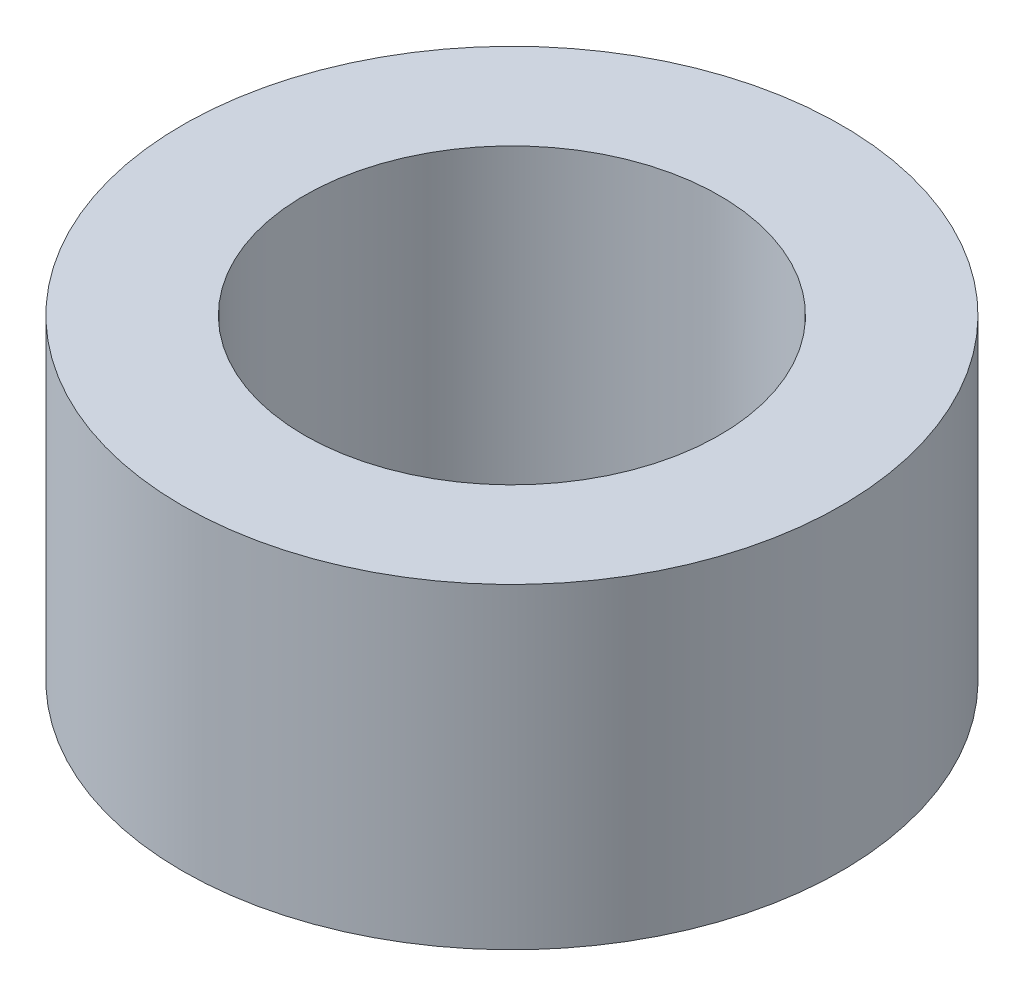
ISO-10303-21;
HEADER;
FILE_DESCRIPTION(('STEP AP214'),'2;1');
FILE_NAME('part.step','',(''),(''),'','','');
FILE_SCHEMA(('AUTOMOTIVE_DESIGN { 1 0 10303 214 1 1 1 1 }'));
ENDSEC;
DATA;
#1=APPLICATION_CONTEXT('core data for automotive mechanical design processes');
#2=APPLICATION_PROTOCOL_DEFINITION('international standard','automotive_design',2000,#1);
#3=PRODUCT_CONTEXT('',#1,'mechanical');
#4=PRODUCT('Part','Part','',(#3));
#5=PRODUCT_RELATED_PRODUCT_CATEGORY('part','',(#4));
#6=PRODUCT_DEFINITION_FORMATION('','',#4);
#7=PRODUCT_DEFINITION_CONTEXT('part definition',#1,'design');
#8=PRODUCT_DEFINITION('design','',#6,#7);
#9=PRODUCT_DEFINITION_SHAPE('','',#8);
#10=(LENGTH_UNIT() NAMED_UNIT(*) SI_UNIT(.MILLI.,.METRE.));
#11=(NAMED_UNIT(*) PLANE_ANGLE_UNIT() SI_UNIT($,.RADIAN.));
#12=(NAMED_UNIT(*) SI_UNIT($,.STERADIAN.) SOLID_ANGLE_UNIT());
#13=UNCERTAINTY_MEASURE_WITH_UNIT(LENGTH_MEASURE(1.E-05),#10,'distance_accuracy_value','');
#14=(GEOMETRIC_REPRESENTATION_CONTEXT(3) GLOBAL_UNCERTAINTY_ASSIGNED_CONTEXT((#13)) GLOBAL_UNIT_ASSIGNED_CONTEXT((#10,
#11,#12)) REPRESENTATION_CONTEXT('',''));
#15=CARTESIAN_POINT('',(0.,0.,0.));
#16=DIRECTION('',(0.,0.,1.));
#17=DIRECTION('',(1.,0.,0.));
#18=AXIS2_PLACEMENT_3D('',#15,#16,#17);
#19=CARTESIAN_POINT('',(0.,-3.048,0.));
#20=DIRECTION('',(0.,1.,0.));
#21=DIRECTION('',(0.,0.,1.));
#22=AXIS2_PLACEMENT_3D('',#19,#20,#21);
#23=CYLINDRICAL_SURFACE('',#22,3.175);
#24=CARTESIAN_POINT('',(0.,-3.048,0.));
#25=DIRECTION('',(0.,1.,0.));
#26=DIRECTION('',(0.,0.,1.));
#27=AXIS2_PLACEMENT_3D('',#24,#25,#26);
#28=CIRCLE('',#27,3.175);
#29=CARTESIAN_POINT('',(0.,-3.048,3.175));
#30=VERTEX_POINT('',#29);
#31=EDGE_CURVE('E10',#30,#30,#28,.T.);
#32=CARTESIAN_POINT('',(0.,0.,0.));
#33=DIRECTION('',(0.,1.,0.));
#34=DIRECTION('',(0.,0.,1.));
#35=AXIS2_PLACEMENT_3D('',#32,#33,#34);
#36=CIRCLE('',#35,3.175);
#37=CARTESIAN_POINT('',(0.,0.,3.175));
#38=VERTEX_POINT('',#37);
#39=EDGE_CURVE('E42',#38,#38,#36,.T.);
#40=CARTESIAN_POINT('',(0.,-3.048,3.175));
#41=CARTESIAN_POINT('',(0.,-3.01625,3.175));
#42=CARTESIAN_POINT('',(0.,-2.9845,3.175));
#43=CARTESIAN_POINT('',(0.,-2.921,3.175));
#44=CARTESIAN_POINT('',(0.,-2.88925,3.175));
#45=CARTESIAN_POINT('',(0.,-2.82575,3.175));
#46=CARTESIAN_POINT('',(0.,-2.794,3.175));
#47=CARTESIAN_POINT('',(0.,-2.7305,3.175));
#48=CARTESIAN_POINT('',(0.,-2.69875,3.175));
#49=CARTESIAN_POINT('',(0.,-2.63525,3.175));
#50=CARTESIAN_POINT('',(0.,-2.6035,3.175));
#51=CARTESIAN_POINT('',(0.,-2.54,3.175));
#52=CARTESIAN_POINT('',(0.,-2.50825,3.175));
#53=CARTESIAN_POINT('',(0.,-2.44475,3.175));
#54=CARTESIAN_POINT('',(0.,-2.413,3.175));
#55=CARTESIAN_POINT('',(0.,-2.3495,3.175));
#56=CARTESIAN_POINT('',(0.,-2.31775,3.175));
#57=CARTESIAN_POINT('',(0.,-2.25425,3.175));
#58=CARTESIAN_POINT('',(0.,-2.2225,3.175));
#59=CARTESIAN_POINT('',(0.,-2.159,3.175));
#60=CARTESIAN_POINT('',(0.,-2.12725,3.175));
#61=CARTESIAN_POINT('',(0.,-2.06375,3.175));
#62=CARTESIAN_POINT('',(0.,-2.032,3.175));
#63=CARTESIAN_POINT('',(0.,-1.9685,3.175));
#64=CARTESIAN_POINT('',(0.,-1.93675,3.175));
#65=CARTESIAN_POINT('',(0.,-1.87325,3.175));
#66=CARTESIAN_POINT('',(0.,-1.8415,3.175));
#67=CARTESIAN_POINT('',(0.,-1.778,3.175));
#68=CARTESIAN_POINT('',(0.,-1.74625,3.175));
#69=CARTESIAN_POINT('',(0.,-1.68275,3.175));
#70=CARTESIAN_POINT('',(0.,-1.651,3.175));
#71=CARTESIAN_POINT('',(0.,-1.5875,3.175));
#72=CARTESIAN_POINT('',(0.,-1.55575,3.175));
#73=CARTESIAN_POINT('',(0.,-1.49225,3.175));
#74=CARTESIAN_POINT('',(0.,-1.4605,3.175));
#75=CARTESIAN_POINT('',(0.,-1.397,3.175));
#76=CARTESIAN_POINT('',(0.,-1.36525,3.175));
#77=CARTESIAN_POINT('',(0.,-1.30175,3.175));
#78=CARTESIAN_POINT('',(0.,-1.27,3.175));
#79=CARTESIAN_POINT('',(0.,-1.2065,3.175));
#80=CARTESIAN_POINT('',(0.,-1.17475,3.175));
#81=CARTESIAN_POINT('',(0.,-1.11125,3.175));
#82=CARTESIAN_POINT('',(0.,-1.0795,3.175));
#83=CARTESIAN_POINT('',(0.,-1.016,3.175));
#84=CARTESIAN_POINT('',(0.,-0.98425,3.175));
#85=CARTESIAN_POINT('',(0.,-0.92075,3.175));
#86=CARTESIAN_POINT('',(0.,-0.889,3.175));
#87=CARTESIAN_POINT('',(0.,-0.8255,3.175));
#88=CARTESIAN_POINT('',(0.,-0.79375,3.175));
#89=CARTESIAN_POINT('',(0.,-0.73025,3.175));
#90=CARTESIAN_POINT('',(0.,-0.6985,3.175));
#91=CARTESIAN_POINT('',(0.,-0.635,3.175));
#92=CARTESIAN_POINT('',(0.,-0.60325,3.175));
#93=CARTESIAN_POINT('',(0.,-0.53975,3.175));
#94=CARTESIAN_POINT('',(0.,-0.508,3.175));
#95=CARTESIAN_POINT('',(0.,-0.4445,3.175));
#96=CARTESIAN_POINT('',(0.,-0.41275,3.175));
#97=CARTESIAN_POINT('',(0.,-0.34925,3.175));
#98=CARTESIAN_POINT('',(0.,-0.3175,3.175));
#99=CARTESIAN_POINT('',(0.,-0.254,3.175));
#100=CARTESIAN_POINT('',(0.,-0.22225,3.175));
#101=CARTESIAN_POINT('',(0.,-0.15875,3.175));
#102=CARTESIAN_POINT('',(0.,-0.127,3.175));
#103=CARTESIAN_POINT('',(0.,-0.0634999999999999,3.175));
#104=CARTESIAN_POINT('',(0.,-0.03175,3.175));
#105=CARTESIAN_POINT('',(0.,0.,3.175));
#106=B_SPLINE_CURVE_WITH_KNOTS('',3,(#40,#41,#42,#43,#44,#45,#46,#47,#48,#49,#50,#51,#52,#53,
#54,#55,#56,#57,#58,#59,#60,#61,#62,#63,#64,#65,#66,#67,#68,#69,#70,#71,#72,#73,#74,#75,#76,#77,
#78,#79,#80,#81,#82,#83,#84,#85,#86,#87,#88,#89,#90,#91,#92,#93,#94,#95,#96,#97,#98,#99,#100,
#101,#102,#103,#104,#105),.UNSPECIFIED.,.F.,.F.,(4,2,2,2,2,2,2,2,2,2,2,2,2,2,2,2,2,2,2,2,2,2,2,
2,2,2,2,2,2,2,2,2,4),(0.,0.0952499999999998,0.1905,0.28575,0.381,0.47625,0.5715,0.66675,0.762,
0.85725,0.9525,1.04775,1.143,1.23825,1.3335,1.42875,1.524,1.61925,1.7145,1.80975,1.905,2.00025,
2.0955,2.19075,2.286,2.38125,2.4765,2.57175,2.667,2.76225,2.8575,2.95275,3.048),.UNSPECIFIED.);
#107=EDGE_CURVE('BSEAM39',#30,#38,#106,.T.);
#108=ORIENTED_EDGE('',*,*,#31,.T.);
#109=ORIENTED_EDGE('',*,*,#39,.F.);
#110=ORIENTED_EDGE('',*,*,#107,.T.);
#111=ORIENTED_EDGE('',*,*,#107,.F.);
#112=EDGE_LOOP('',(#108,#110,#109,#111));
#113=FACE_BOUND('',#112,.T.);
#114=ADVANCED_FACE('F39',(#113),#23,.T.);
#115=CARTESIAN_POINT('',(0.,-3.048,0.));
#116=DIRECTION('',(0.,1.,0.));
#117=DIRECTION('',(0.,0.,1.));
#118=AXIS2_PLACEMENT_3D('',#115,#116,#117);
#119=PLANE('',#118);
#120=CARTESIAN_POINT('',(0.,-3.048,0.));
#121=DIRECTION('',(0.,1.,0.));
#122=DIRECTION('',(0.,0.,1.));
#123=AXIS2_PLACEMENT_3D('',#120,#121,#122);
#124=CIRCLE('',#123,2.);
#125=CARTESIAN_POINT('',(0.,-3.048,2.));
#126=VERTEX_POINT('',#125);
#127=EDGE_CURVE('E51',#126,#126,#124,.T.);
#128=ORIENTED_EDGE('',*,*,#127,.T.);
#129=EDGE_LOOP('',(#128));
#130=FACE_BOUND('',#129,.T.);
#131=ORIENTED_EDGE('',*,*,#31,.F.);
#132=EDGE_LOOP('',(#131));
#133=FACE_BOUND('',#132,.T.);
#134=ADVANCED_FACE('F61',(#130,#133),#119,.F.);
#135=CARTESIAN_POINT('',(0.,0.,0.));
#136=DIRECTION('',(0.,1.,0.));
#137=DIRECTION('',(0.,0.,1.));
#138=AXIS2_PLACEMENT_3D('',#135,#136,#137);
#139=PLANE('',#138);
#140=CARTESIAN_POINT('',(0.,0.,0.));
#141=DIRECTION('',(0.,1.,0.));
#142=DIRECTION('',(0.,0.,1.));
#143=AXIS2_PLACEMENT_3D('',#140,#141,#142);
#144=CIRCLE('',#143,2.);
#145=CARTESIAN_POINT('',(0.,0.,2.));
#146=VERTEX_POINT('',#145);
#147=EDGE_CURVE('E53',#146,#146,#144,.T.);
#148=ORIENTED_EDGE('',*,*,#147,.F.);
#149=EDGE_LOOP('',(#148));
#150=FACE_BOUND('',#149,.T.);
#151=ORIENTED_EDGE('',*,*,#39,.T.);
#152=EDGE_LOOP('',(#151));
#153=FACE_BOUND('',#152,.T.);
#154=ADVANCED_FACE('F67',(#150,#153),#139,.T.);
#155=CARTESIAN_POINT('',(0.,-3.048,0.));
#156=DIRECTION('',(0.,1.,0.));
#157=DIRECTION('',(0.,0.,1.));
#158=AXIS2_PLACEMENT_3D('',#155,#156,#157);
#159=CYLINDRICAL_SURFACE('',#158,2.);
#160=CARTESIAN_POINT('',(0.,-3.048,2.));
#161=CARTESIAN_POINT('',(0.,-3.01625,2.));
#162=CARTESIAN_POINT('',(0.,-2.9845,2.));
#163=CARTESIAN_POINT('',(0.,-2.921,2.));
#164=CARTESIAN_POINT('',(0.,-2.88925,2.));
#165=CARTESIAN_POINT('',(0.,-2.82575,2.));
#166=CARTESIAN_POINT('',(0.,-2.794,2.));
#167=CARTESIAN_POINT('',(0.,-2.7305,2.));
#168=CARTESIAN_POINT('',(0.,-2.69875,2.));
#169=CARTESIAN_POINT('',(0.,-2.63525,2.));
#170=CARTESIAN_POINT('',(0.,-2.6035,2.));
#171=CARTESIAN_POINT('',(0.,-2.54,2.));
#172=CARTESIAN_POINT('',(0.,-2.50825,2.));
#173=CARTESIAN_POINT('',(0.,-2.44475,2.));
#174=CARTESIAN_POINT('',(0.,-2.413,2.));
#175=CARTESIAN_POINT('',(0.,-2.3495,2.));
#176=CARTESIAN_POINT('',(0.,-2.31775,2.));
#177=CARTESIAN_POINT('',(0.,-2.25425,2.));
#178=CARTESIAN_POINT('',(0.,-2.2225,2.));
#179=CARTESIAN_POINT('',(0.,-2.159,2.));
#180=CARTESIAN_POINT('',(0.,-2.12725,2.));
#181=CARTESIAN_POINT('',(0.,-2.06375,2.));
#182=CARTESIAN_POINT('',(0.,-2.032,2.));
#183=CARTESIAN_POINT('',(0.,-1.9685,2.));
#184=CARTESIAN_POINT('',(0.,-1.93675,2.));
#185=CARTESIAN_POINT('',(0.,-1.87325,2.));
#186=CARTESIAN_POINT('',(0.,-1.8415,2.));
#187=CARTESIAN_POINT('',(0.,-1.778,2.));
#188=CARTESIAN_POINT('',(0.,-1.74625,2.));
#189=CARTESIAN_POINT('',(0.,-1.68275,2.));
#190=CARTESIAN_POINT('',(0.,-1.651,2.));
#191=CARTESIAN_POINT('',(0.,-1.5875,2.));
#192=CARTESIAN_POINT('',(0.,-1.55575,2.));
#193=CARTESIAN_POINT('',(0.,-1.49225,2.));
#194=CARTESIAN_POINT('',(0.,-1.4605,2.));
#195=CARTESIAN_POINT('',(0.,-1.397,2.));
#196=CARTESIAN_POINT('',(0.,-1.36525,2.));
#197=CARTESIAN_POINT('',(0.,-1.30175,2.));
#198=CARTESIAN_POINT('',(0.,-1.27,2.));
#199=CARTESIAN_POINT('',(0.,-1.2065,2.));
#200=CARTESIAN_POINT('',(0.,-1.17475,2.));
#201=CARTESIAN_POINT('',(0.,-1.11125,2.));
#202=CARTESIAN_POINT('',(0.,-1.0795,2.));
#203=CARTESIAN_POINT('',(0.,-1.016,2.));
#204=CARTESIAN_POINT('',(0.,-0.98425,2.));
#205=CARTESIAN_POINT('',(0.,-0.92075,2.));
#206=CARTESIAN_POINT('',(0.,-0.889,2.));
#207=CARTESIAN_POINT('',(0.,-0.8255,2.));
#208=CARTESIAN_POINT('',(0.,-0.79375,2.));
#209=CARTESIAN_POINT('',(0.,-0.73025,2.));
#210=CARTESIAN_POINT('',(0.,-0.6985,2.));
#211=CARTESIAN_POINT('',(0.,-0.635,2.));
#212=CARTESIAN_POINT('',(0.,-0.60325,2.));
#213=CARTESIAN_POINT('',(0.,-0.53975,2.));
#214=CARTESIAN_POINT('',(0.,-0.508,2.));
#215=CARTESIAN_POINT('',(0.,-0.4445,2.));
#216=CARTESIAN_POINT('',(0.,-0.41275,2.));
#217=CARTESIAN_POINT('',(0.,-0.34925,2.));
#218=CARTESIAN_POINT('',(0.,-0.3175,2.));
#219=CARTESIAN_POINT('',(0.,-0.254,2.));
#220=CARTESIAN_POINT('',(0.,-0.22225,2.));
#221=CARTESIAN_POINT('',(0.,-0.15875,2.));
#222=CARTESIAN_POINT('',(0.,-0.127,2.));
#223=CARTESIAN_POINT('',(0.,-0.0634999999999999,2.));
#224=CARTESIAN_POINT('',(0.,-0.03175,2.));
#225=CARTESIAN_POINT('',(0.,0.,2.));
#226=B_SPLINE_CURVE_WITH_KNOTS('',3,(#160,#161,#162,#163,#164,#165,#166,#167,#168,#169,#170,
#171,#172,#173,#174,#175,#176,#177,#178,#179,#180,#181,#182,#183,#184,#185,#186,#187,#188,#189,
#190,#191,#192,#193,#194,#195,#196,#197,#198,#199,#200,#201,#202,#203,#204,#205,#206,#207,#208,
#209,#210,#211,#212,#213,#214,#215,#216,#217,#218,#219,#220,#221,#222,#223,#224,#225),
.UNSPECIFIED.,.F.,.F.,(4,2,2,2,2,2,2,2,2,2,2,2,2,2,2,2,2,2,2,2,2,2,2,2,2,2,2,2,2,2,2,2,4),(0.,
0.0952500000000003,0.1905,0.28575,0.381,0.47625,0.5715,0.66675,0.762000000000001,0.85725,0.9525,
1.04775,1.143,1.23825,1.3335,1.42875,1.524,1.61925,1.7145,1.80975,1.905,2.00025,2.0955,2.19075,
2.286,2.38125,2.4765,2.57175,2.667,2.76225,2.8575,2.95275,3.048),.UNSPECIFIED.);
#227=EDGE_CURVE('BSEAM64',#126,#146,#226,.T.);
#228=ORIENTED_EDGE('',*,*,#127,.F.);
#229=ORIENTED_EDGE('',*,*,#147,.T.);
#230=ORIENTED_EDGE('',*,*,#227,.T.);
#231=ORIENTED_EDGE('',*,*,#227,.F.);
#232=EDGE_LOOP('',(#228,#230,#229,#231));
#233=FACE_BOUND('',#232,.T.);
#234=ADVANCED_FACE('F64',(#233),#159,.F.);
#235=CLOSED_SHELL('',(#114,#134,#154,#234));
#236=MANIFOLD_SOLID_BREP('B2',#235);
#237=ADVANCED_BREP_SHAPE_REPRESENTATION('',(#18,#236),#14);
#238=SHAPE_DEFINITION_REPRESENTATION(#9,#237);
ENDSEC;
END-ISO-10303-21;
